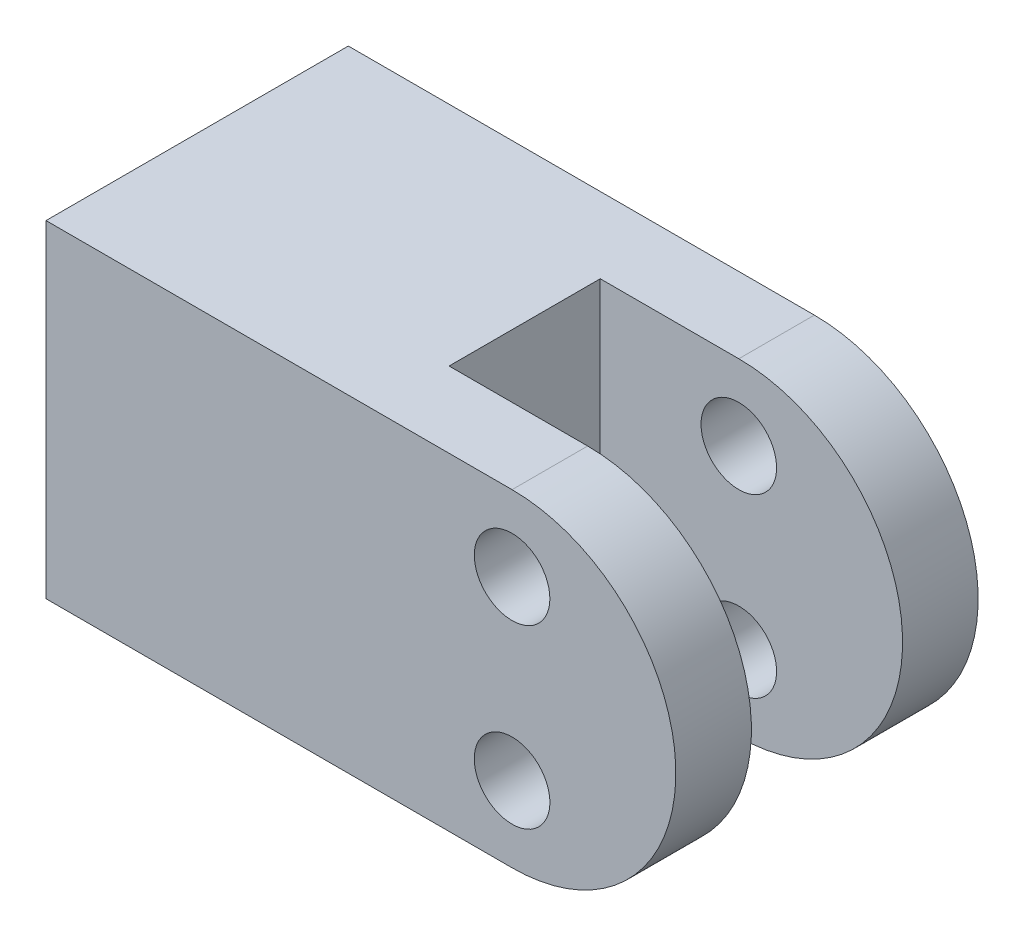
ISO-10303-21;
HEADER;
FILE_DESCRIPTION(('STEP AP214'),'2;1');
FILE_NAME('part.step','',(''),(''),'','','');
FILE_SCHEMA(('AUTOMOTIVE_DESIGN { 1 0 10303 214 1 1 1 1 }'));
ENDSEC;
DATA;
#1=APPLICATION_CONTEXT('core data for automotive mechanical design processes');
#2=APPLICATION_PROTOCOL_DEFINITION('international standard','automotive_design',2000,#1);
#3=PRODUCT_CONTEXT('',#1,'mechanical');
#4=PRODUCT('Part','Part','',(#3));
#5=PRODUCT_RELATED_PRODUCT_CATEGORY('part','',(#4));
#6=PRODUCT_DEFINITION_FORMATION('','',#4);
#7=PRODUCT_DEFINITION_CONTEXT('part definition',#1,'design');
#8=PRODUCT_DEFINITION('design','',#6,#7);
#9=PRODUCT_DEFINITION_SHAPE('','',#8);
#10=(LENGTH_UNIT() NAMED_UNIT(*) SI_UNIT(.MILLI.,.METRE.));
#11=(NAMED_UNIT(*) PLANE_ANGLE_UNIT() SI_UNIT($,.RADIAN.));
#12=(NAMED_UNIT(*) SI_UNIT($,.STERADIAN.) SOLID_ANGLE_UNIT());
#13=UNCERTAINTY_MEASURE_WITH_UNIT(LENGTH_MEASURE(1.E-05),#10,'distance_accuracy_value','');
#14=(GEOMETRIC_REPRESENTATION_CONTEXT(3) GLOBAL_UNCERTAINTY_ASSIGNED_CONTEXT((#13)) GLOBAL_UNIT_ASSIGNED_CONTEXT((#10,
#11,#12)) REPRESENTATION_CONTEXT('',''));
#15=CARTESIAN_POINT('',(0.,0.,0.));
#16=DIRECTION('',(0.,0.,1.));
#17=DIRECTION('',(1.,0.,0.));
#18=AXIS2_PLACEMENT_3D('',#15,#16,#17);
#19=CARTESIAN_POINT('',(0.,0.,6.));
#20=DIRECTION('',(0.,0.,-1.));
#21=DIRECTION('',(-1.,0.,0.));
#22=AXIS2_PLACEMENT_3D('',#19,#20,#21);
#23=CYLINDRICAL_SURFACE('',#22,6.5);
#24=CARTESIAN_POINT('',(0.,0.,3.));
#25=DIRECTION('',(0.,0.,1.));
#26=DIRECTION('',(1.,0.,0.));
#27=AXIS2_PLACEMENT_3D('',#24,#25,#26);
#28=CIRCLE('',#27,6.5);
#29=CARTESIAN_POINT('',(0.,-6.5,3.));
#30=VERTEX_POINT('',#29);
#31=CARTESIAN_POINT('',(0.,6.5,3.));
#32=VERTEX_POINT('',#31);
#33=EDGE_CURVE('E150',#30,#32,#28,.T.);
#34=ORIENTED_EDGE('',*,*,#33,.T.);
#35=DIRECTION('',(0.,0.,-1.));
#36=VECTOR('',#35,1.);
#37=CARTESIAN_POINT('',(0.,6.5,6.));
#38=LINE('',#37,#36);
#39=CARTESIAN_POINT('',(0.,6.5,6.));
#40=VERTEX_POINT('',#39);
#41=EDGE_CURVE('E11',#40,#32,#38,.T.);
#42=ORIENTED_EDGE('',*,*,#41,.F.);
#43=CARTESIAN_POINT('',(0.,0.,6.));
#44=DIRECTION('',(0.,0.,1.));
#45=DIRECTION('',(-1.,0.,0.));
#46=AXIS2_PLACEMENT_3D('',#43,#44,#45);
#47=CIRCLE('',#46,6.5);
#48=CARTESIAN_POINT('',(0.,-6.5,6.));
#49=VERTEX_POINT('',#48);
#50=EDGE_CURVE('E165',#49,#40,#47,.T.);
#51=ORIENTED_EDGE('',*,*,#50,.F.);
#52=DIRECTION('',(0.,0.,-1.));
#53=VECTOR('',#52,1.);
#54=CARTESIAN_POINT('',(0.,-6.5,6.));
#55=LINE('',#54,#53);
#56=EDGE_CURVE('E178',#49,#30,#55,.T.);
#57=ORIENTED_EDGE('',*,*,#56,.T.);
#58=EDGE_LOOP('',(#34,#42,#51,#57));
#59=FACE_BOUND('',#58,.T.);
#60=ADVANCED_FACE('F36',(#59),#23,.T.);
#61=CARTESIAN_POINT('',(0.,-3.5,6.));
#62=DIRECTION('',(0.,0.,-1.));
#63=DIRECTION('',(-1.,0.,0.));
#64=AXIS2_PLACEMENT_3D('',#61,#62,#63);
#65=CYLINDRICAL_SURFACE('',#64,1.5);
#66=CARTESIAN_POINT('',(0.,-3.5,3.));
#67=DIRECTION('',(0.,0.,1.));
#68=DIRECTION('',(1.,0.,0.));
#69=AXIS2_PLACEMENT_3D('',#66,#67,#68);
#70=CIRCLE('',#69,1.5);
#71=CARTESIAN_POINT('',(1.5,-3.5,3.));
#72=VERTEX_POINT('',#71);
#73=EDGE_CURVE('E147',#72,#72,#70,.T.);
#74=ORIENTED_EDGE('',*,*,#73,.F.);
#75=EDGE_LOOP('',(#74));
#76=FACE_BOUND('',#75,.T.);
#77=CARTESIAN_POINT('',(0.,-3.5,6.));
#78=DIRECTION('',(0.,0.,1.));
#79=DIRECTION('',(-1.,0.,0.));
#80=AXIS2_PLACEMENT_3D('',#77,#78,#79);
#81=CIRCLE('',#80,1.5);
#82=CARTESIAN_POINT('',(-1.5,-3.5,6.));
#83=VERTEX_POINT('',#82);
#84=EDGE_CURVE('E159',#83,#83,#81,.T.);
#85=ORIENTED_EDGE('',*,*,#84,.T.);
#86=EDGE_LOOP('',(#85));
#87=FACE_BOUND('',#86,.T.);
#88=ADVANCED_FACE('F212',(#76,#87),#65,.F.);
#89=CARTESIAN_POINT('',(0.,3.5,6.));
#90=DIRECTION('',(0.,0.,-1.));
#91=DIRECTION('',(-1.,0.,0.));
#92=AXIS2_PLACEMENT_3D('',#89,#90,#91);
#93=CYLINDRICAL_SURFACE('',#92,1.5);
#94=CARTESIAN_POINT('',(0.,3.5,3.));
#95=DIRECTION('',(0.,0.,1.));
#96=DIRECTION('',(1.,0.,0.));
#97=AXIS2_PLACEMENT_3D('',#94,#95,#96);
#98=CIRCLE('',#97,1.5);
#99=CARTESIAN_POINT('',(1.5,3.5,3.));
#100=VERTEX_POINT('',#99);
#101=EDGE_CURVE('E40',#100,#100,#98,.T.);
#102=ORIENTED_EDGE('',*,*,#101,.F.);
#103=EDGE_LOOP('',(#102));
#104=FACE_BOUND('',#103,.T.);
#105=CARTESIAN_POINT('',(0.,3.5,6.));
#106=DIRECTION('',(0.,0.,1.));
#107=DIRECTION('',(1.,0.,0.));
#108=AXIS2_PLACEMENT_3D('',#105,#106,#107);
#109=CIRCLE('',#108,1.5);
#110=CARTESIAN_POINT('',(1.5,3.5,6.));
#111=VERTEX_POINT('',#110);
#112=EDGE_CURVE('E153',#111,#111,#109,.T.);
#113=ORIENTED_EDGE('',*,*,#112,.T.);
#114=EDGE_LOOP('',(#113));
#115=FACE_BOUND('',#114,.T.);
#116=ADVANCED_FACE('F196',(#104,#115),#93,.F.);
#117=CARTESIAN_POINT('',(0.,0.,6.));
#118=DIRECTION('',(0.,0.,-1.));
#119=DIRECTION('',(-1.,0.,0.));
#120=AXIS2_PLACEMENT_3D('',#117,#118,#119);
#121=PLANE('',#120);
#122=ORIENTED_EDGE('',*,*,#50,.T.);
#123=DIRECTION('',(-1.,0.,0.));
#124=VECTOR('',#123,1.);
#125=CARTESIAN_POINT('',(-18.5,6.5,6.));
#126=LINE('',#125,#124);
#127=CARTESIAN_POINT('',(-18.5,6.5,6.));
#128=VERTEX_POINT('',#127);
#129=EDGE_CURVE('E91',#40,#128,#126,.T.);
#130=ORIENTED_EDGE('',*,*,#129,.T.);
#131=DIRECTION('',(0.,-1.,0.));
#132=VECTOR('',#131,1.);
#133=CARTESIAN_POINT('',(-18.5,6.5,6.));
#134=LINE('',#133,#132);
#135=CARTESIAN_POINT('',(-18.5,-6.5,6.));
#136=VERTEX_POINT('',#135);
#137=EDGE_CURVE('E169',#128,#136,#134,.T.);
#138=ORIENTED_EDGE('',*,*,#137,.T.);
#139=DIRECTION('',(1.,0.,0.));
#140=VECTOR('',#139,1.);
#141=CARTESIAN_POINT('',(-18.5,-6.5,6.));
#142=LINE('',#141,#140);
#143=EDGE_CURVE('E62',#136,#49,#142,.T.);
#144=ORIENTED_EDGE('',*,*,#143,.T.);
#145=EDGE_LOOP('',(#122,#130,#138,#144));
#146=FACE_BOUND('',#145,.T.);
#147=ORIENTED_EDGE('',*,*,#84,.F.);
#148=EDGE_LOOP('',(#147));
#149=FACE_BOUND('',#148,.T.);
#150=ORIENTED_EDGE('',*,*,#112,.F.);
#151=EDGE_LOOP('',(#150));
#152=FACE_BOUND('',#151,.T.);
#153=ADVANCED_FACE('F201',(#146,#149,#152),#121,.F.);
#154=CARTESIAN_POINT('',(0.,0.,-6.));
#155=DIRECTION('',(0.,0.,-1.));
#156=DIRECTION('',(-1.,0.,0.));
#157=AXIS2_PLACEMENT_3D('',#154,#155,#156);
#158=PLANE('',#157);
#159=CARTESIAN_POINT('',(0.,-3.5,-6.));
#160=DIRECTION('',(0.,0.,1.));
#161=DIRECTION('',(-1.,0.,0.));
#162=AXIS2_PLACEMENT_3D('',#159,#160,#161);
#163=CIRCLE('',#162,1.5);
#164=CARTESIAN_POINT('',(-1.5,-3.5,-6.));
#165=VERTEX_POINT('',#164);
#166=EDGE_CURVE('E156',#165,#165,#163,.T.);
#167=ORIENTED_EDGE('',*,*,#166,.T.);
#168=EDGE_LOOP('',(#167));
#169=FACE_BOUND('',#168,.T.);
#170=CARTESIAN_POINT('',(0.,0.,-6.));
#171=DIRECTION('',(0.,0.,1.));
#172=DIRECTION('',(-1.,0.,0.));
#173=AXIS2_PLACEMENT_3D('',#170,#171,#172);
#174=CIRCLE('',#173,6.5);
#175=CARTESIAN_POINT('',(0.,-6.5,-6.));
#176=VERTEX_POINT('',#175);
#177=CARTESIAN_POINT('',(0.,6.5,-6.));
#178=VERTEX_POINT('',#177);
#179=EDGE_CURVE('E162',#176,#178,#174,.T.);
#180=ORIENTED_EDGE('',*,*,#179,.F.);
#181=DIRECTION('',(1.,0.,0.));
#182=VECTOR('',#181,1.);
#183=CARTESIAN_POINT('',(-18.5,-6.5,-6.));
#184=LINE('',#183,#182);
#185=CARTESIAN_POINT('',(-18.5,-6.5,-6.));
#186=VERTEX_POINT('',#185);
#187=EDGE_CURVE('E167',#186,#176,#184,.T.);
#188=ORIENTED_EDGE('',*,*,#187,.F.);
#189=DIRECTION('',(0.,-1.,0.));
#190=VECTOR('',#189,1.);
#191=CARTESIAN_POINT('',(-18.5,6.5,-6.));
#192=LINE('',#191,#190);
#193=CARTESIAN_POINT('',(-18.5,6.5,-6.));
#194=VERTEX_POINT('',#193);
#195=EDGE_CURVE('E175',#194,#186,#192,.T.);
#196=ORIENTED_EDGE('',*,*,#195,.F.);
#197=DIRECTION('',(-1.,0.,0.));
#198=VECTOR('',#197,1.);
#199=CARTESIAN_POINT('',(-18.5,6.5,-6.));
#200=LINE('',#199,#198);
#201=EDGE_CURVE('E173',#178,#194,#200,.T.);
#202=ORIENTED_EDGE('',*,*,#201,.F.);
#203=EDGE_LOOP('',(#180,#188,#196,#202));
#204=FACE_BOUND('',#203,.T.);
#205=CARTESIAN_POINT('',(0.,3.5,-6.));
#206=DIRECTION('',(0.,0.,1.));
#207=DIRECTION('',(1.,0.,0.));
#208=AXIS2_PLACEMENT_3D('',#205,#206,#207);
#209=CIRCLE('',#208,1.5);
#210=CARTESIAN_POINT('',(1.5,3.5,-6.));
#211=VERTEX_POINT('',#210);
#212=EDGE_CURVE('E152',#211,#211,#209,.T.);
#213=ORIENTED_EDGE('',*,*,#212,.T.);
#214=EDGE_LOOP('',(#213));
#215=FACE_BOUND('',#214,.T.);
#216=ADVANCED_FACE('F199',(#169,#204,#215),#158,.T.);
#217=CARTESIAN_POINT('',(0.,6.5,-3.));
#218=VERTEX_POINT('',#217);
#219=EDGE_CURVE('E45',#218,#178,#38,.T.);
#220=ORIENTED_EDGE('',*,*,#219,.F.);
#221=CARTESIAN_POINT('',(0.,0.,-3.));
#222=DIRECTION('',(0.,0.,-1.));
#223=DIRECTION('',(-1.,0.,0.));
#224=AXIS2_PLACEMENT_3D('',#221,#222,#223);
#225=CIRCLE('',#224,6.5);
#226=CARTESIAN_POINT('',(0.,-6.5,-3.));
#227=VERTEX_POINT('',#226);
#228=EDGE_CURVE('E117',#218,#227,#225,.T.);
#229=ORIENTED_EDGE('',*,*,#228,.T.);
#230=EDGE_CURVE('E84',#227,#176,#55,.T.);
#231=ORIENTED_EDGE('',*,*,#230,.T.);
#232=ORIENTED_EDGE('',*,*,#179,.T.);
#233=EDGE_LOOP('',(#220,#229,#231,#232));
#234=FACE_BOUND('',#233,.T.);
#235=ADVANCED_FACE('F38',(#234),#23,.T.);
#236=CARTESIAN_POINT('',(-18.5,6.5,6.));
#237=DIRECTION('',(0.,-1.,0.));
#238=DIRECTION('',(0.,0.,-1.));
#239=AXIS2_PLACEMENT_3D('',#236,#237,#238);
#240=PLANE('',#239);
#241=ORIENTED_EDGE('',*,*,#41,.T.);
#242=DIRECTION('',(1.,0.,0.));
#243=VECTOR('',#242,1.);
#244=CARTESIAN_POINT('',(-5.50000000000001,6.5,3.));
#245=LINE('',#244,#243);
#246=CARTESIAN_POINT('',(-5.50000000000001,6.5,3.));
#247=VERTEX_POINT('',#246);
#248=EDGE_CURVE('E131',#247,#32,#245,.T.);
#249=ORIENTED_EDGE('',*,*,#248,.F.);
#250=DIRECTION('',(0.,0.,1.));
#251=VECTOR('',#250,1.);
#252=CARTESIAN_POINT('',(-5.50000000000001,6.5,-3.));
#253=LINE('',#252,#251);
#254=CARTESIAN_POINT('',(-5.50000000000001,6.5,-3.));
#255=VERTEX_POINT('',#254);
#256=EDGE_CURVE('E120',#255,#247,#253,.T.);
#257=ORIENTED_EDGE('',*,*,#256,.F.);
#258=DIRECTION('',(-1.,0.,0.));
#259=VECTOR('',#258,1.);
#260=CARTESIAN_POINT('',(-5.50000000000001,6.5,-3.));
#261=LINE('',#260,#259);
#262=EDGE_CURVE('E112',#218,#255,#261,.T.);
#263=ORIENTED_EDGE('',*,*,#262,.F.);
#264=ORIENTED_EDGE('',*,*,#219,.T.);
#265=ORIENTED_EDGE('',*,*,#201,.T.);
#266=DIRECTION('',(0.,0.,-1.));
#267=VECTOR('',#266,1.);
#268=CARTESIAN_POINT('',(-18.5,6.5,6.));
#269=LINE('',#268,#267);
#270=EDGE_CURVE('E184',#128,#194,#269,.T.);
#271=ORIENTED_EDGE('',*,*,#270,.F.);
#272=ORIENTED_EDGE('',*,*,#129,.F.);
#273=EDGE_LOOP('',(#241,#249,#257,#263,#264,#265,#271,#272));
#274=FACE_BOUND('',#273,.T.);
#275=ADVANCED_FACE('F129',(#274),#240,.F.);
#276=CARTESIAN_POINT('',(-18.5,6.5,6.));
#277=DIRECTION('',(1.,0.,0.));
#278=DIRECTION('',(0.,0.,-1.));
#279=AXIS2_PLACEMENT_3D('',#276,#277,#278);
#280=PLANE('',#279);
#281=CARTESIAN_POINT('',(-18.5,0.,0.));
#282=DIRECTION('',(-1.,0.,0.));
#283=DIRECTION('',(0.,0.,1.));
#284=AXIS2_PLACEMENT_3D('',#281,#282,#283);
#285=CIRCLE('',#284,2.);
#286=CARTESIAN_POINT('',(-18.5,0.,2.));
#287=VERTEX_POINT('',#286);
#288=EDGE_CURVE('E276',#287,#287,#285,.T.);
#289=ORIENTED_EDGE('',*,*,#288,.F.);
#290=EDGE_LOOP('',(#289));
#291=FACE_BOUND('',#290,.T.);
#292=ORIENTED_EDGE('',*,*,#195,.T.);
#293=DIRECTION('',(0.,0.,-1.));
#294=VECTOR('',#293,1.);
#295=CARTESIAN_POINT('',(-18.5,-6.5,6.));
#296=LINE('',#295,#294);
#297=EDGE_CURVE('E181',#136,#186,#296,.T.);
#298=ORIENTED_EDGE('',*,*,#297,.F.);
#299=ORIENTED_EDGE('',*,*,#137,.F.);
#300=ORIENTED_EDGE('',*,*,#270,.T.);
#301=EDGE_LOOP('',(#292,#298,#299,#300));
#302=FACE_BOUND('',#301,.T.);
#303=ADVANCED_FACE('F232',(#291,#302),#280,.F.);
#304=CARTESIAN_POINT('',(-18.5,-6.5,6.));
#305=DIRECTION('',(0.,1.,0.));
#306=DIRECTION('',(0.,0.,1.));
#307=AXIS2_PLACEMENT_3D('',#304,#305,#306);
#308=PLANE('',#307);
#309=DIRECTION('',(0.,0.,1.));
#310=VECTOR('',#309,1.);
#311=CARTESIAN_POINT('',(-5.50000000000001,-6.5,-3.));
#312=LINE('',#311,#310);
#313=CARTESIAN_POINT('',(-5.50000000000001,-6.5,-3.));
#314=VERTEX_POINT('',#313);
#315=CARTESIAN_POINT('',(-5.50000000000001,-6.5,3.));
#316=VERTEX_POINT('',#315);
#317=EDGE_CURVE('E53',#314,#316,#312,.T.);
#318=ORIENTED_EDGE('',*,*,#317,.T.);
#319=DIRECTION('',(1.,0.,0.));
#320=VECTOR('',#319,1.);
#321=CARTESIAN_POINT('',(-5.50000000000001,-6.5,3.));
#322=LINE('',#321,#320);
#323=EDGE_CURVE('E127',#316,#30,#322,.T.);
#324=ORIENTED_EDGE('',*,*,#323,.T.);
#325=ORIENTED_EDGE('',*,*,#56,.F.);
#326=ORIENTED_EDGE('',*,*,#143,.F.);
#327=ORIENTED_EDGE('',*,*,#297,.T.);
#328=ORIENTED_EDGE('',*,*,#187,.T.);
#329=ORIENTED_EDGE('',*,*,#230,.F.);
#330=DIRECTION('',(-1.,0.,0.));
#331=VECTOR('',#330,1.);
#332=CARTESIAN_POINT('',(-5.50000000000001,-6.5,-3.));
#333=LINE('',#332,#331);
#334=EDGE_CURVE('E133',#227,#314,#333,.T.);
#335=ORIENTED_EDGE('',*,*,#334,.T.);
#336=EDGE_LOOP('',(#318,#324,#325,#326,#327,#328,#329,#335));
#337=FACE_BOUND('',#336,.T.);
#338=ADVANCED_FACE('F224',(#337),#308,.F.);
#339=CARTESIAN_POINT('',(0.,-3.5,-3.));
#340=DIRECTION('',(0.,0.,-1.));
#341=DIRECTION('',(-1.,0.,0.));
#342=AXIS2_PLACEMENT_3D('',#339,#340,#341);
#343=CIRCLE('',#342,1.5);
#344=CARTESIAN_POINT('',(-1.5,-3.5,-3.));
#345=VERTEX_POINT('',#344);
#346=EDGE_CURVE('E143',#345,#345,#343,.T.);
#347=ORIENTED_EDGE('',*,*,#346,.F.);
#348=EDGE_LOOP('',(#347));
#349=FACE_BOUND('',#348,.T.);
#350=ORIENTED_EDGE('',*,*,#166,.F.);
#351=EDGE_LOOP('',(#350));
#352=FACE_BOUND('',#351,.T.);
#353=ADVANCED_FACE('F194',(#349,#352),#65,.F.);
#354=CARTESIAN_POINT('',(0.,3.5,-3.));
#355=DIRECTION('',(0.,0.,-1.));
#356=DIRECTION('',(-1.,0.,0.));
#357=AXIS2_PLACEMENT_3D('',#354,#355,#356);
#358=CIRCLE('',#357,1.5);
#359=CARTESIAN_POINT('',(-1.5,3.5,-3.));
#360=VERTEX_POINT('',#359);
#361=EDGE_CURVE('E141',#360,#360,#358,.T.);
#362=ORIENTED_EDGE('',*,*,#361,.F.);
#363=EDGE_LOOP('',(#362));
#364=FACE_BOUND('',#363,.T.);
#365=ORIENTED_EDGE('',*,*,#212,.F.);
#366=EDGE_LOOP('',(#365));
#367=FACE_BOUND('',#366,.T.);
#368=ADVANCED_FACE('F190',(#364,#367),#93,.F.);
#369=CARTESIAN_POINT('',(-5.50000000000001,-6.5,3.));
#370=DIRECTION('',(0.,0.,1.));
#371=DIRECTION('',(1.,0.,0.));
#372=AXIS2_PLACEMENT_3D('',#369,#370,#371);
#373=PLANE('',#372);
#374=ORIENTED_EDGE('',*,*,#73,.T.);
#375=EDGE_LOOP('',(#374));
#376=FACE_BOUND('',#375,.T.);
#377=ORIENTED_EDGE('',*,*,#101,.T.);
#378=EDGE_LOOP('',(#377));
#379=FACE_BOUND('',#378,.T.);
#380=ORIENTED_EDGE('',*,*,#33,.F.);
#381=ORIENTED_EDGE('',*,*,#323,.F.);
#382=DIRECTION('',(0.,1.,0.));
#383=VECTOR('',#382,1.);
#384=CARTESIAN_POINT('',(-5.50000000000001,-6.5,3.));
#385=LINE('',#384,#383);
#386=EDGE_CURVE('E126',#316,#247,#385,.T.);
#387=ORIENTED_EDGE('',*,*,#386,.T.);
#388=ORIENTED_EDGE('',*,*,#248,.T.);
#389=EDGE_LOOP('',(#380,#381,#387,#388));
#390=FACE_BOUND('',#389,.T.);
#391=ADVANCED_FACE('F193',(#376,#379,#390),#373,.F.);
#392=CARTESIAN_POINT('',(-5.50000000000001,-6.5,-3.));
#393=DIRECTION('',(0.,0.,-1.));
#394=DIRECTION('',(-1.,0.,0.));
#395=AXIS2_PLACEMENT_3D('',#392,#393,#394);
#396=PLANE('',#395);
#397=ORIENTED_EDGE('',*,*,#346,.T.);
#398=EDGE_LOOP('',(#397));
#399=FACE_BOUND('',#398,.T.);
#400=ORIENTED_EDGE('',*,*,#361,.T.);
#401=EDGE_LOOP('',(#400));
#402=FACE_BOUND('',#401,.T.);
#403=ORIENTED_EDGE('',*,*,#262,.T.);
#404=DIRECTION('',(0.,1.,0.));
#405=VECTOR('',#404,1.);
#406=CARTESIAN_POINT('',(-5.50000000000001,-6.5,-3.));
#407=LINE('',#406,#405);
#408=EDGE_CURVE('E115',#314,#255,#407,.T.);
#409=ORIENTED_EDGE('',*,*,#408,.F.);
#410=ORIENTED_EDGE('',*,*,#334,.F.);
#411=ORIENTED_EDGE('',*,*,#228,.F.);
#412=EDGE_LOOP('',(#403,#409,#410,#411));
#413=FACE_BOUND('',#412,.T.);
#414=ADVANCED_FACE('F113',(#399,#402,#413),#396,.F.);
#415=CARTESIAN_POINT('',(-5.50000000000001,-6.5,-3.));
#416=DIRECTION('',(-1.,0.,0.));
#417=DIRECTION('',(0.,0.,1.));
#418=AXIS2_PLACEMENT_3D('',#415,#416,#417);
#419=PLANE('',#418);
#420=ORIENTED_EDGE('',*,*,#386,.F.);
#421=ORIENTED_EDGE('',*,*,#317,.F.);
#422=ORIENTED_EDGE('',*,*,#408,.T.);
#423=ORIENTED_EDGE('',*,*,#256,.T.);
#424=EDGE_LOOP('',(#420,#421,#422,#423));
#425=FACE_BOUND('',#424,.T.);
#426=ADVANCED_FACE('F124',(#425),#419,.F.);
#427=CARTESIAN_POINT('',(-8.50000000000001,0.,0.));
#428=DIRECTION('',(-1.,0.,0.));
#429=DIRECTION('',(0.,0.,1.));
#430=AXIS2_PLACEMENT_3D('',#427,#428,#429);
#431=CYLINDRICAL_SURFACE('',#430,2.);
#432=CARTESIAN_POINT('',(-8.50000000000001,0.,0.));
#433=DIRECTION('',(-1.,0.,0.));
#434=DIRECTION('',(0.,0.,1.));
#435=AXIS2_PLACEMENT_3D('',#432,#433,#434);
#436=CIRCLE('',#435,2.);
#437=CARTESIAN_POINT('',(-8.50000000000001,0.,2.));
#438=VERTEX_POINT('',#437);
#439=EDGE_CURVE('E121',#438,#438,#436,.T.);
#440=ORIENTED_EDGE('',*,*,#439,.F.);
#441=EDGE_LOOP('',(#440));
#442=FACE_BOUND('',#441,.T.);
#443=ORIENTED_EDGE('',*,*,#288,.T.);
#444=EDGE_LOOP('',(#443));
#445=FACE_BOUND('',#444,.T.);
#446=ADVANCED_FACE('F259',(#442,#445),#431,.F.);
#447=CARTESIAN_POINT('',(-8.50000000000001,0.,0.));
#448=DIRECTION('',(-1.,0.,0.));
#449=DIRECTION('',(0.,0.,1.));
#450=AXIS2_PLACEMENT_3D('',#447,#448,#449);
#451=PLANE('',#450);
#452=ORIENTED_EDGE('',*,*,#439,.T.);
#453=EDGE_LOOP('',(#452));
#454=FACE_BOUND('',#453,.T.);
#455=ADVANCED_FACE('F268',(#454),#451,.T.);
#456=CLOSED_SHELL('',(#60,#88,#116,#153,#216,#235,#275,#303,#338,#353,#368,#391,#414,#426,#446,#455));
#457=MANIFOLD_SOLID_BREP('B2',#456);
#458=ADVANCED_BREP_SHAPE_REPRESENTATION('',(#18,#457),#14);
#459=SHAPE_DEFINITION_REPRESENTATION(#9,#458);
ENDSEC;
END-ISO-10303-21;
